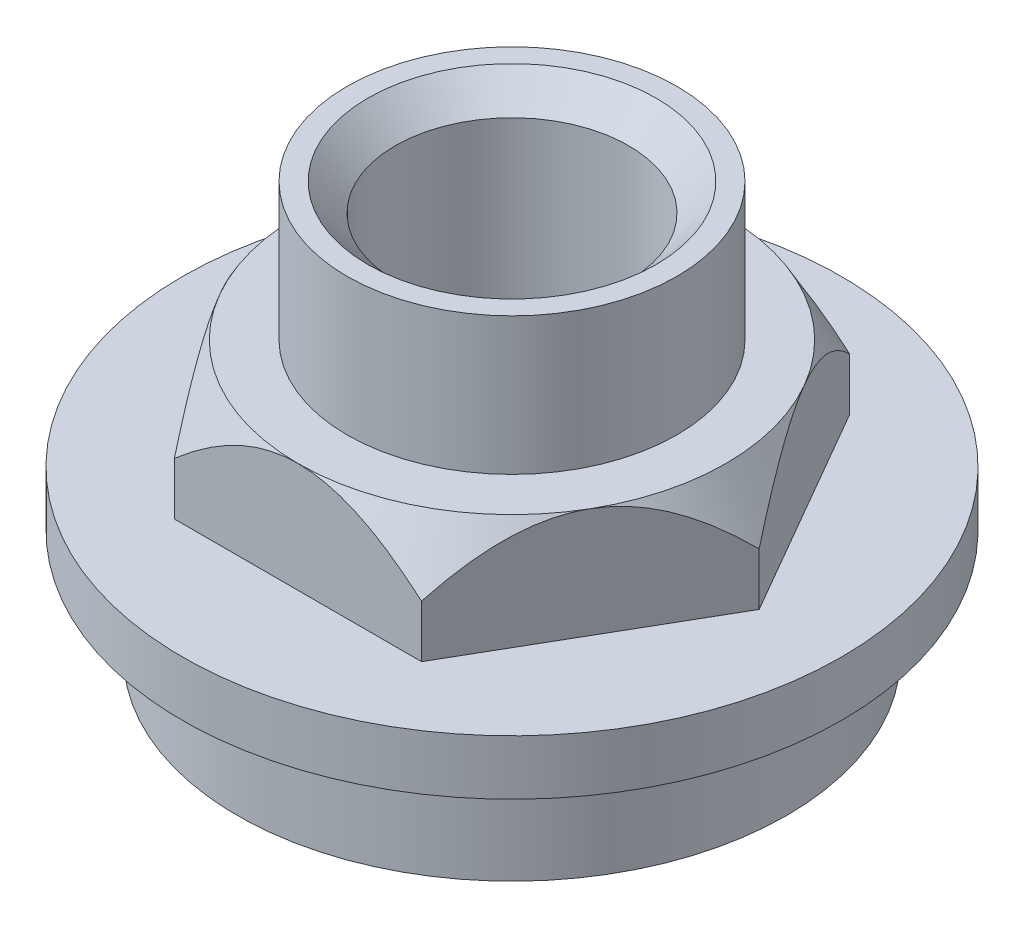
ISO-10303-21;
HEADER;
FILE_DESCRIPTION(('STEP AP214'),'2;1');
FILE_NAME('part.step','',(''),(''),'','','');
FILE_SCHEMA(('AUTOMOTIVE_DESIGN { 1 0 10303 214 1 1 1 1 }'));
ENDSEC;
DATA;
#1=APPLICATION_CONTEXT('core data for automotive mechanical design processes');
#2=APPLICATION_PROTOCOL_DEFINITION('international standard','automotive_design',2000,#1);
#3=PRODUCT_CONTEXT('',#1,'mechanical');
#4=PRODUCT('Part','Part','',(#3));
#5=PRODUCT_RELATED_PRODUCT_CATEGORY('part','',(#4));
#6=PRODUCT_DEFINITION_FORMATION('','',#4);
#7=PRODUCT_DEFINITION_CONTEXT('part definition',#1,'design');
#8=PRODUCT_DEFINITION('design','',#6,#7);
#9=PRODUCT_DEFINITION_SHAPE('','',#8);
#10=(LENGTH_UNIT() NAMED_UNIT(*) SI_UNIT(.MILLI.,.METRE.));
#11=(NAMED_UNIT(*) PLANE_ANGLE_UNIT() SI_UNIT($,.RADIAN.));
#12=(NAMED_UNIT(*) SI_UNIT($,.STERADIAN.) SOLID_ANGLE_UNIT());
#13=UNCERTAINTY_MEASURE_WITH_UNIT(LENGTH_MEASURE(1.E-05),#10,'distance_accuracy_value','');
#14=(GEOMETRIC_REPRESENTATION_CONTEXT(3) GLOBAL_UNCERTAINTY_ASSIGNED_CONTEXT((#13)) GLOBAL_UNIT_ASSIGNED_CONTEXT((#10,
#11,#12)) REPRESENTATION_CONTEXT('',''));
#15=CARTESIAN_POINT('',(0.,0.,0.));
#16=DIRECTION('',(0.,0.,1.));
#17=DIRECTION('',(1.,0.,0.));
#18=AXIS2_PLACEMENT_3D('',#15,#16,#17);
#19=CARTESIAN_POINT('',(4.5,10.,7.79422863405995));
#20=DIRECTION('',(-0.866025403784439,0.,-0.5));
#21=DIRECTION('',(-0.5,0.,0.866025403784439));
#22=AXIS2_PLACEMENT_3D('',#19,#20,#21);
#23=PLANE('',#22);
#24=CARTESIAN_POINT('',(4.49988452994616,7.91134272803115,7.79442863405995));
#25=CARTESIAN_POINT('',(4.5469510184849,7.99285906031349,7.712907084577));
#26=CARTESIAN_POINT('',(4.59448714699452,8.07328813536249,7.63057209480322));
#27=CARTESIAN_POINT('',(4.69060205581968,8.2316686769512,7.46409618935319));
#28=CARTESIAN_POINT('',(4.73918112969393,8.30961943018347,7.37995476521835));
#29=CARTESIAN_POINT('',(4.88709777078411,8.54000989560685,7.12375562756521));
#30=CARTESIAN_POINT('',(4.98813710765249,8.68815048798431,6.94875036254611));
#31=CARTESIAN_POINT('',(5.19808135019413,8.9729043963429,6.58511626770743));
#32=CARTESIAN_POINT('',(5.30712202681952,9.10912101165321,6.39625227570057));
#33=CARTESIAN_POINT('',(5.53111033178537,9.35984182078718,6.00829315119849));
#34=CARTESIAN_POINT('',(5.6460441637903,9.4743940251588,5.80922191465736));
#35=CARTESIAN_POINT('',(5.82820631895738,9.62916753436301,5.49370780669172));
#36=CARTESIAN_POINT('',(5.89330227441066,9.67947095523846,5.38095830447941));
#37=CARTESIAN_POINT('',(6.02519904670249,9.77032656179815,5.15250639351562));
#38=CARTESIAN_POINT('',(6.09199999078582,9.81087801731713,5.03680376436973));
#39=CARTESIAN_POINT('',(6.22650981257967,9.88067960177475,4.80382591890573));
#40=CARTESIAN_POINT('',(6.29420732390426,9.91001661422817,4.68657038974557));
#41=CARTESIAN_POINT('',(6.43062051230754,9.95678043096796,4.45029581660863));
#42=CARTESIAN_POINT('',(6.49933598790428,9.97420956079184,4.33127712160881));
#43=CARTESIAN_POINT('',(6.63791764656769,9.99656524465314,4.09124664780663));
#44=CARTESIAN_POINT('',(6.70778859796391,10.0013750652999,3.9702266100152));
#45=CARTESIAN_POINT('',(6.84744881862966,9.99794690494827,3.72832801202584));
#46=CARTESIAN_POINT('',(6.91723808817838,9.98970896867745,3.60744945134434));
#47=CARTESIAN_POINT('',(7.05631115031233,9.96050385692376,3.36656784176414));
#48=CARTESIAN_POINT('',(7.12559331830037,9.93950603592559,3.24656760675034));
#49=CARTESIAN_POINT('',(7.26298314963467,9.88560081510433,3.00860143843602));
#50=CARTESIAN_POINT('',(7.33109065093595,9.85269178568396,2.89063578580563));
#51=CARTESIAN_POINT('',(7.48522662157557,9.76505322936994,2.62366445338386));
#52=CARTESIAN_POINT('',(7.57074920249273,9.7067666131301,2.47553499804093));
#53=CARTESIAN_POINT('',(7.73884586442757,9.57508749850433,2.18438303898706));
#54=CARTESIAN_POINT('',(7.82141809167024,9.50168569216718,2.04136374610863));
#55=CARTESIAN_POINT('',(7.98381507448529,9.34215693481394,1.76008392087707));
#56=CARTESIAN_POINT('',(8.06362739797011,9.25597982700241,1.62184492153124));
#57=CARTESIAN_POINT('',(8.22024968961756,9.07348373491166,1.35056715479999));
#58=CARTESIAN_POINT('',(8.29706014911755,8.97716641996914,1.2175275363933));
#59=CARTESIAN_POINT('',(8.48304577260882,8.72955133612262,0.895390987029038));
#60=CARTESIAN_POINT('',(8.59064709350533,8.57352723276889,0.70902003227475));
#61=CARTESIAN_POINT('',(8.74760621190608,8.33064343239095,0.437158864493428));
#62=CARTESIAN_POINT('',(8.79890771345037,8.24869527168679,0.348302057314164));
#63=CARTESIAN_POINT('',(8.90035113450391,8.08201555452612,0.172596897955812));
#64=CARTESIAN_POINT('',(8.9504932910241,7.99728457570383,0.0857481352617818));
#65=CARTESIAN_POINT('',(9.00011547005384,7.91134272803116,-0.000200000000001088));
#66=B_SPLINE_CURVE_WITH_KNOTS('',3,(#24,#25,#26,#27,#28,#29,#30,#31,#32,#33,#34,#35,#36,#37,#38,
#39,#40,#41,#42,#43,#44,#45,#46,#47,#48,#49,#50,#51,#52,#53,#54,#55,#56,#57,#58,#59,#60,#61,#62,
#63,#64,#65),.UNSPECIFIED.,.F.,.F.,(4,2,2,2,2,2,2,2,2,2,2,2,2,2,2,2,2,2,2,2,4),(0.,
0.373551511019635,0.747209581351023,1.49833166618197,2.26885967368786,3.03765957313689,
3.45605911485134,3.87448997392117,4.28960997527388,4.70464888300762,5.12351373808427,
5.54237715730016,5.96225056204638,6.38218143227597,6.92340652775619,7.46496591231953,
8.00871075270872,8.55236621839015,9.34903128480968,9.7429348056886,10.1367570737811),.UNSPECIFIED.);
#67=CARTESIAN_POINT('',(4.5,7.9115427318801,7.79422863405995));
#68=VERTEX_POINT('',#67);
#69=CARTESIAN_POINT('',(6.75,10.,3.89711431702997));
#70=VERTEX_POINT('',#69);
#71=EDGE_CURVE('E111',#68,#70,#66,.T.);
#72=ORIENTED_EDGE('',*,*,#71,.F.);
#73=DIRECTION('',(0.,-1.,0.));
#74=VECTOR('',#73,1.);
#75=CARTESIAN_POINT('',(4.5,10.,7.79422863405995));
#76=LINE('',#75,#74);
#77=CARTESIAN_POINT('',(4.5,6.,7.79422863405995));
#78=VERTEX_POINT('',#77);
#79=EDGE_CURVE('E322',#68,#78,#76,.T.);
#80=ORIENTED_EDGE('',*,*,#79,.T.);
#81=DIRECTION('',(0.5,0.,-0.866025403784439));
#82=VECTOR('',#81,1.);
#83=CARTESIAN_POINT('',(4.5,6.,7.79422863405995));
#84=LINE('',#83,#82);
#85=CARTESIAN_POINT('',(9.,6.,0.));
#86=VERTEX_POINT('',#85);
#87=EDGE_CURVE('E307',#78,#86,#84,.T.);
#88=ORIENTED_EDGE('',*,*,#87,.T.);
#89=DIRECTION('',(0.,-1.,0.));
#90=VECTOR('',#89,1.);
#91=CARTESIAN_POINT('',(9.,10.,0.));
#92=LINE('',#91,#90);
#93=CARTESIAN_POINT('',(9.,7.91154273188011,0.));
#94=VERTEX_POINT('',#93);
#95=EDGE_CURVE('E59',#94,#86,#92,.T.);
#96=ORIENTED_EDGE('',*,*,#95,.F.);
#97=EDGE_CURVE('E121',#70,#94,#66,.T.);
#98=ORIENTED_EDGE('',*,*,#97,.F.);
#99=EDGE_LOOP('',(#72,#80,#88,#96,#98));
#100=FACE_BOUND('',#99,.T.);
#101=ADVANCED_FACE('F36',(#100),#23,.F.);
#102=CARTESIAN_POINT('',(9.,10.,0.));
#103=DIRECTION('',(-0.866025403784438,0.,0.5));
#104=DIRECTION('',(0.5,0.,0.866025403784439));
#105=AXIS2_PLACEMENT_3D('',#102,#103,#104);
#106=PLANE('',#105);
#107=CARTESIAN_POINT('',(9.00011547005384,7.91134272803116,0.00019999999999863));
#108=CARTESIAN_POINT('',(8.9530489815151,7.9928590603135,-0.0813215494829471));
#109=CARTESIAN_POINT('',(8.90551285300548,8.0732881353625,-0.163656539256728));
#110=CARTESIAN_POINT('',(8.80939794418032,8.23166867695121,-0.33013244470676));
#111=CARTESIAN_POINT('',(8.76081887030607,8.30961943018348,-0.414273868841603));
#112=CARTESIAN_POINT('',(8.61290222921588,8.54000989560686,-0.670473006494739));
#113=CARTESIAN_POINT('',(8.5118628923475,8.68815048798432,-0.84547827151384));
#114=CARTESIAN_POINT('',(8.30191864980587,8.97290439634291,-1.20911236635251));
#115=CARTESIAN_POINT('',(8.19287797318048,9.10912101165322,-1.39797635835938));
#116=CARTESIAN_POINT('',(7.96888966821463,9.35984182078719,-1.78593548286146));
#117=CARTESIAN_POINT('',(7.8539558362097,9.47439402515881,-1.98500671940258));
#118=CARTESIAN_POINT('',(7.67179368104261,9.62916753436302,-2.30052082736823));
#119=CARTESIAN_POINT('',(7.60669772558933,9.67947095523846,-2.41327032958054));
#120=CARTESIAN_POINT('',(7.47480095329751,9.77032656179815,-2.64172224054433));
#121=CARTESIAN_POINT('',(7.40800000921418,9.81087801731714,-2.75742486969022));
#122=CARTESIAN_POINT('',(7.27349018742032,9.88067960177475,-2.99040271515422));
#123=CARTESIAN_POINT('',(7.20579267609573,9.91001661422818,-3.10765824431437));
#124=CARTESIAN_POINT('',(7.06937948769246,9.95678043096796,-3.34393281745131));
#125=CARTESIAN_POINT('',(7.00066401209571,9.97420956079185,-3.46295151245113));
#126=CARTESIAN_POINT('',(6.86208235343231,9.99656524465314,-3.70298198625332));
#127=CARTESIAN_POINT('',(6.79221140203609,10.0013750652999,-3.82400202404475));
#128=CARTESIAN_POINT('',(6.65255118137034,9.99794690494827,-4.06590062203411));
#129=CARTESIAN_POINT('',(6.58276191182162,9.98970896867745,-4.18677918271561));
#130=CARTESIAN_POINT('',(6.44368884968766,9.96050385692376,-4.4276607922958));
#131=CARTESIAN_POINT('',(6.37440668169963,9.93950603592559,-4.5476610273096));
#132=CARTESIAN_POINT('',(6.23701685036533,9.88560081510433,-4.78562719562393));
#133=CARTESIAN_POINT('',(6.16890934906405,9.85269178568397,-4.90359284825431));
#134=CARTESIAN_POINT('',(6.01477337842442,9.76505322936995,-5.17056418067609));
#135=CARTESIAN_POINT('',(5.92925079750727,9.7067666131301,-5.31869363601901));
#136=CARTESIAN_POINT('',(5.76115413557243,9.57508749850433,-5.60984559507289));
#137=CARTESIAN_POINT('',(5.67858190832976,9.50168569216718,-5.75286488795132));
#138=CARTESIAN_POINT('',(5.5161849255147,9.34215693481394,-6.03414471318288));
#139=CARTESIAN_POINT('',(5.43637260202989,9.25597982700242,-6.17238371252871));
#140=CARTESIAN_POINT('',(5.27975031038244,9.07348373491167,-6.44366147925996));
#141=CARTESIAN_POINT('',(5.20293985088245,8.97716641996914,-6.57670109766664));
#142=CARTESIAN_POINT('',(5.01695422739118,8.72955133612262,-6.8988376470309));
#143=CARTESIAN_POINT('',(4.90935290649466,8.57352723276889,-7.0852086017852));
#144=CARTESIAN_POINT('',(4.75239378809391,8.33064343239095,-7.35706976956652));
#145=CARTESIAN_POINT('',(4.70109228654963,8.24869527168678,-7.44592657674578));
#146=CARTESIAN_POINT('',(4.59964886549608,8.08201555452612,-7.62163173610413));
#147=CARTESIAN_POINT('',(4.5495067089759,7.99728457570383,-7.70848049879816));
#148=CARTESIAN_POINT('',(4.49988452994616,7.91134272803115,-7.79442863405995));
#149=B_SPLINE_CURVE_WITH_KNOTS('',3,(#107,#108,#109,#110,#111,#112,#113,#114,#115,#116,#117,
#118,#119,#120,#121,#122,#123,#124,#125,#126,#127,#128,#129,#130,#131,#132,#133,#134,#135,#136,
#137,#138,#139,#140,#141,#142,#143,#144,#145,#146,#147,#148),.UNSPECIFIED.,.F.,.F.,(4,2,2,2,2,2,
2,2,2,2,2,2,2,2,2,2,2,2,2,2,4),(0.,0.373551511019635,0.747209581351022,1.49833166618197,
2.26885967368786,3.03765957313689,3.45605911485133,3.87448997392117,4.28960997527388,
4.70464888300762,5.12351373808427,5.54237715730016,5.96225056204637,6.38218143227597,
6.92340652775618,7.46496591231953,8.00871075270872,8.55236621839015,9.34903128480968,
9.74293480568861,10.1367570737811),.UNSPECIFIED.);
#150=CARTESIAN_POINT('',(6.75,10.,-3.89711431702997));
#151=VERTEX_POINT('',#150);
#152=EDGE_CURVE('E127',#94,#151,#149,.T.);
#153=ORIENTED_EDGE('',*,*,#152,.F.);
#154=ORIENTED_EDGE('',*,*,#95,.T.);
#155=DIRECTION('',(-0.5,0.,-0.866025403784438));
#156=VECTOR('',#155,1.);
#157=CARTESIAN_POINT('',(9.,6.,0.));
#158=LINE('',#157,#156);
#159=CARTESIAN_POINT('',(4.5,6.,-7.79422863405995));
#160=VERTEX_POINT('',#159);
#161=EDGE_CURVE('E309',#86,#160,#158,.T.);
#162=ORIENTED_EDGE('',*,*,#161,.T.);
#163=DIRECTION('',(0.,-1.,0.));
#164=VECTOR('',#163,1.);
#165=CARTESIAN_POINT('',(4.5,10.,-7.79422863405995));
#166=LINE('',#165,#164);
#167=CARTESIAN_POINT('',(4.49999999999999,7.91154273188011,-7.79422863405995));
#168=VERTEX_POINT('',#167);
#169=EDGE_CURVE('E207',#168,#160,#166,.T.);
#170=ORIENTED_EDGE('',*,*,#169,.F.);
#171=EDGE_CURVE('E136',#151,#168,#149,.T.);
#172=ORIENTED_EDGE('',*,*,#171,.F.);
#173=EDGE_LOOP('',(#153,#154,#162,#170,#172));
#174=FACE_BOUND('',#173,.T.);
#175=ADVANCED_FACE('F198',(#174),#106,.F.);
#176=CARTESIAN_POINT('',(4.5,10.,-7.79422863405995));
#177=DIRECTION('',(0.,0.,1.));
#178=DIRECTION('',(1.,0.,0.));
#179=AXIS2_PLACEMENT_3D('',#176,#177,#178);
#180=PLANE('',#179);
#181=CARTESIAN_POINT('',(-10.3189194004154,1.10155601884791,-7.79422863405995));
#182=CARTESIAN_POINT('',(-10.1026892607673,1.40034541665737,-7.79422863405995));
#183=CARTESIAN_POINT('',(-9.88488755277598,1.69801229142663,-7.79422863405995));
#184=CARTESIAN_POINT('',(-9.44541693321907,2.29057045380564,-7.79422863405995));
#185=CARTESIAN_POINT('',(-9.22374723153252,2.5854611549258,-7.79422863405995));
#186=CARTESIAN_POINT('',(-8.77392653751467,3.17440328969509,-7.79422863405995));
#187=CARTESIAN_POINT('',(-8.54573557999823,3.46842427613291,-7.79422863405995));
#188=CARTESIAN_POINT('',(-8.08385965209259,4.05208341853964,-7.79422863405995));
#189=CARTESIAN_POINT('',(-7.85017521926269,4.34172199882378,-7.79422863405995));
#190=CARTESIAN_POINT('',(-7.35043659841696,4.9465455921992,-7.79422863405995));
#191=CARTESIAN_POINT('',(-7.08361737316929,5.26110065806897,-7.79422863405995));
#192=CARTESIAN_POINT('',(-6.53950552419685,5.88128603376838,-7.79422863405995));
#193=CARTESIAN_POINT('',(-6.26220951122522,6.18691339779437,-7.79422863405995));
#194=CARTESIAN_POINT('',(-5.83681843706123,6.635308278016,-7.79422863405995));
#195=CARTESIAN_POINT('',(-5.69372867534287,6.78282710372589,-7.79422863405995));
#196=CARTESIAN_POINT('',(-5.4037712211181,7.07409651729314,-7.79422863405995));
#197=CARTESIAN_POINT('',(-5.25690379899336,7.21784737335983,-7.79422863405995));
#198=CARTESIAN_POINT('',(-4.95894101024782,7.50072676793045,-7.79422863405995));
#199=CARTESIAN_POINT('',(-4.8078482618162,7.63985805690835,-7.79422863405995));
#200=CARTESIAN_POINT('',(-4.50074931290881,7.9125670536672,-7.79422863405995));
#201=CARTESIAN_POINT('',(-4.34474396486314,8.04614571570409,-7.79422863405995));
#202=CARTESIAN_POINT('',(-4.08866742494503,8.2559974433133,-7.79422863405995));
#203=CARTESIAN_POINT('',(-3.99035321674057,8.33441428098617,-7.79422863405995));
#204=CARTESIAN_POINT('',(-3.79144177238735,8.48829293533106,-7.79422863405995));
#205=CARTESIAN_POINT('',(-3.6908445126818,8.56375472149062,-7.79422863405995));
#206=CARTESIAN_POINT('',(-3.38522670149573,8.7851669939984,-7.79422863405995));
#207=CARTESIAN_POINT('',(-3.17647314313998,8.92606708067272,-7.79422863405995));
#208=CARTESIAN_POINT('',(-2.75103533104867,9.18784556255837,-7.79422863405995));
#209=CARTESIAN_POINT('',(-2.53452023074788,9.30899614864572,-7.79422863405995));
#210=CARTESIAN_POINT('',(-2.08999866291142,9.52793364114923,-7.79422863405995));
#211=CARTESIAN_POINT('',(-1.86200724776275,9.62575023295267,-7.79422863405995));
#212=CARTESIAN_POINT('',(-1.50061495492531,9.75378794641114,-7.79422863405995));
#213=CARTESIAN_POINT('',(-1.37093816981285,9.79459663586465,-7.79422863405995));
#214=CARTESIAN_POINT('',(-1.10876958694867,9.86592912524405,-7.79422863405995));
#215=CARTESIAN_POINT('',(-0.976278224988463,9.89645450521162,-7.79422863405995));
#216=CARTESIAN_POINT('',(-0.709274672158217,9.94616591482603,-7.79422863405995));
#217=CARTESIAN_POINT('',(-0.574764147986172,9.96536082048052,-7.79422863405995));
#218=CARTESIAN_POINT('',(-0.304555515636597,9.99171756938012,-7.79422863405995));
#219=CARTESIAN_POINT('',(-0.16885740404954,9.99887937806717,-7.79422863405995));
#220=CARTESIAN_POINT('',(0.102978110753352,10.0008795138909,-7.79422863405995));
#221=CARTESIAN_POINT('',(0.239115749705859,9.99568626831545,-7.79422863405995));
#222=CARTESIAN_POINT('',(0.510366402233498,9.97312488457935,-7.79422863405995));
#223=CARTESIAN_POINT('',(0.645479417470799,9.95575676617332,-7.79422863405995));
#224=CARTESIAN_POINT('',(0.913835484487121,9.90949818610705,-7.79422863405995));
#225=CARTESIAN_POINT('',(1.04707658770439,9.88059652333766,-7.79422863405995));
#226=CARTESIAN_POINT('',(1.31082259932374,9.81227866070904,-7.79422863405995));
#227=CARTESIAN_POINT('',(1.44132709372183,9.77286088213662,-7.79422863405995));
#228=CARTESIAN_POINT('',(1.75628736858611,9.66512151535156,-7.79422863405995));
#229=CARTESIAN_POINT('',(1.93901294882939,9.59173312009571,-7.79422863405995));
#230=CARTESIAN_POINT('',(2.29722481819613,9.42904010292295,-7.79422863405995));
#231=CARTESIAN_POINT('',(2.47270687033781,9.33972632373957,-7.79422863405995));
#232=CARTESIAN_POINT('',(2.81822438864309,9.14743704712432,-7.79422863405995));
#233=CARTESIAN_POINT('',(2.98818906710186,9.04433549604081,-7.79422863405995));
#234=CARTESIAN_POINT('',(3.32129235175154,8.8278656294455,-7.79422863405995));
#235=CARTESIAN_POINT('',(3.48443343805567,8.71450109238476,-7.79422863405995));
#236=CARTESIAN_POINT('',(3.90042461276207,8.40932953814065,-7.79422863405995));
#237=CARTESIAN_POINT('',(4.14858813196132,8.21114954405065,-7.79422863405995));
#238=CARTESIAN_POINT('',(4.63235139279009,7.79990569963162,-7.79422863405995));
#239=CARTESIAN_POINT('',(4.86794208081603,7.58683137237168,-7.79422863405995));
#240=CARTESIAN_POINT('',(5.32968329690669,7.14902926121048,-7.79422863405995));
#241=CARTESIAN_POINT('',(5.55579428682315,6.92426003567569,-7.79422863405995));
#242=CARTESIAN_POINT('',(5.99947978246801,6.46661804206938,-7.79422863405995));
#243=CARTESIAN_POINT('',(6.21705659107266,6.23374749252367,-7.79422863405995));
#244=CARTESIAN_POINT('',(6.63086567426931,5.77758379751534,-7.79422863405995));
#245=CARTESIAN_POINT('',(6.82754974773812,5.55469868896423,-7.79422863405995));
#246=CARTESIAN_POINT('',(7.21585221929807,5.1045333447795,-7.79422863405995));
#247=CARTESIAN_POINT('',(7.40747014282666,4.87725270083052,-7.79422863405995));
#248=CARTESIAN_POINT('',(7.78471383254186,4.42119084224828,-7.79422863405995));
#249=CARTESIAN_POINT('',(7.97037783252336,4.19244116166559,-7.79422863405995));
#250=CARTESIAN_POINT('',(8.33802656288638,3.73209132728566,-7.79422863405995));
#251=CARTESIAN_POINT('',(8.52001216723017,3.50049187212358,-7.79422863405995));
#252=CARTESIAN_POINT('',(8.70047507928161,3.26772875291554,-7.79422863405995));
#253=B_SPLINE_CURVE_WITH_KNOTS('',3,(#181,#182,#183,#184,#185,#186,#187,#188,#189,#190,#191,
#192,#193,#194,#195,#196,#197,#198,#199,#200,#201,#202,#203,#204,#205,#206,#207,#208,#209,#210,
#211,#212,#213,#214,#215,#216,#217,#218,#219,#220,#221,#222,#223,#224,#225,#226,#227,#228,#229,
#230,#231,#232,#233,#234,#235,#236,#237,#238,#239,#240,#241,#242,#243,#244,#245,#246,#247,#248,
#249,#250,#251,#252),.UNSPECIFIED.,.F.,.F.,(4,2,2,2,2,2,2,2,2,2,2,2,2,2,2,2,2,2,2,2,2,2,2,2,2,2,
2,2,2,2,2,2,2,2,2,4),(0.,1.1064825097829,2.21319375162325,3.32968533580857,4.44606811774192,
5.68333974898371,6.92101512425871,7.53750628679426,8.15395344680041,8.77002674324424,
9.38599372192553,9.76321386521185,10.1404379024708,10.8952482369644,11.6385655596191,
12.3809321335025,12.7884195841924,13.1958443954056,13.6029496152714,14.0100560043075,
14.4182038500076,14.8263510334592,15.2348955683653,15.6435014698392,16.233247190709,
16.8233331217286,17.4192388946999,18.014926162588,18.9667928608557,19.9193359904176,
20.8755211313956,21.8314464535492,22.7231321715073,23.6149011226994,24.4987050563704,
25.3822964753754),.UNSPECIFIED.);
#254=CARTESIAN_POINT('',(0.,10.,-7.79422863405994));
#255=VERTEX_POINT('',#254);
#256=EDGE_CURVE('E192',#168,#255,#253,.F.);
#257=ORIENTED_EDGE('',*,*,#256,.F.);
#258=ORIENTED_EDGE('',*,*,#169,.T.);
#259=DIRECTION('',(-1.,0.,0.));
#260=VECTOR('',#259,1.);
#261=CARTESIAN_POINT('',(4.5,6.,-7.79422863405995));
#262=LINE('',#261,#260);
#263=CARTESIAN_POINT('',(-4.50000000000001,6.,-7.79422863405995));
#264=VERTEX_POINT('',#263);
#265=EDGE_CURVE('E225',#160,#264,#262,.T.);
#266=ORIENTED_EDGE('',*,*,#265,.T.);
#267=DIRECTION('',(0.,-1.,0.));
#268=VECTOR('',#267,1.);
#269=CARTESIAN_POINT('',(-4.5,10.,-7.79422863405995));
#270=LINE('',#269,#268);
#271=CARTESIAN_POINT('',(-4.5,7.9115427318801,-7.79422863405995));
#272=VERTEX_POINT('',#271);
#273=EDGE_CURVE('E223',#272,#264,#270,.T.);
#274=ORIENTED_EDGE('',*,*,#273,.F.);
#275=EDGE_CURVE('E186',#255,#272,#253,.F.);
#276=ORIENTED_EDGE('',*,*,#275,.F.);
#277=EDGE_LOOP('',(#257,#258,#266,#274,#276));
#278=FACE_BOUND('',#277,.T.);
#279=ADVANCED_FACE('F194',(#278),#180,.F.);
#280=CARTESIAN_POINT('',(-4.5,10.,-7.79422863405995));
#281=DIRECTION('',(0.866025403784439,0.,0.5));
#282=DIRECTION('',(0.5,0.,-0.866025403784439));
#283=AXIS2_PLACEMENT_3D('',#280,#281,#282);
#284=PLANE('',#283);
#285=CARTESIAN_POINT('',(-4.49988452994616,7.91134272803115,-7.79442863405995));
#286=CARTESIAN_POINT('',(-4.5469510184849,7.99285906031349,-7.712907084577));
#287=CARTESIAN_POINT('',(-4.59448714699452,8.07328813536249,-7.63057209480322));
#288=CARTESIAN_POINT('',(-4.69060205581968,8.2316686769512,-7.46409618935319));
#289=CARTESIAN_POINT('',(-4.73918112969393,8.30961943018347,-7.37995476521835));
#290=CARTESIAN_POINT('',(-4.88709777078412,8.54000989560685,-7.12375562756521));
#291=CARTESIAN_POINT('',(-4.9881371076525,8.68815048798431,-6.94875036254611));
#292=CARTESIAN_POINT('',(-5.19808135019413,8.9729043963429,-6.58511626770743));
#293=CARTESIAN_POINT('',(-5.30712202681952,9.10912101165321,-6.39625227570057));
#294=CARTESIAN_POINT('',(-5.53111033178537,9.35984182078718,-6.00829315119849));
#295=CARTESIAN_POINT('',(-5.6460441637903,9.4743940251588,-5.80922191465736));
#296=CARTESIAN_POINT('',(-5.82820631895739,9.62916753436301,-5.49370780669172));
#297=CARTESIAN_POINT('',(-5.89330227441067,9.67947095523846,-5.38095830447941));
#298=CARTESIAN_POINT('',(-6.02519904670249,9.77032656179815,-5.15250639351562));
#299=CARTESIAN_POINT('',(-6.09199999078582,9.81087801731713,-5.03680376436973));
#300=CARTESIAN_POINT('',(-6.22650981257968,9.88067960177474,-4.80382591890573));
#301=CARTESIAN_POINT('',(-6.29420732390427,9.91001661422817,-4.68657038974557));
#302=CARTESIAN_POINT('',(-6.43062051230754,9.95678043096796,-4.45029581660863));
#303=CARTESIAN_POINT('',(-6.49933598790428,9.97420956079184,-4.33127712160881));
#304=CARTESIAN_POINT('',(-6.63791764656769,9.99656524465313,-4.09124664780663));
#305=CARTESIAN_POINT('',(-6.70778859796391,10.0013750652999,-3.9702266100152));
#306=CARTESIAN_POINT('',(-6.84744881862966,9.99794690494826,-3.72832801202583));
#307=CARTESIAN_POINT('',(-6.91723808817838,9.98970896867745,-3.60744945134434));
#308=CARTESIAN_POINT('',(-7.05631115031234,9.96050385692375,-3.36656784176414));
#309=CARTESIAN_POINT('',(-7.12559331830037,9.93950603592558,-3.24656760675034));
#310=CARTESIAN_POINT('',(-7.26298314963467,9.88560081510432,-3.00860143843602));
#311=CARTESIAN_POINT('',(-7.33109065093595,9.85269178568396,-2.89063578580564));
#312=CARTESIAN_POINT('',(-7.48522662157557,9.76505322936994,-2.62366445338386));
#313=CARTESIAN_POINT('',(-7.57074920249273,9.70676661313009,-2.47553499804093));
#314=CARTESIAN_POINT('',(-7.73884586442757,9.57508749850432,-2.18438303898706));
#315=CARTESIAN_POINT('',(-7.82141809167024,9.50168569216718,-2.04136374610863));
#316=CARTESIAN_POINT('',(-7.98381507448529,9.34215693481393,-1.76008392087707));
#317=CARTESIAN_POINT('',(-8.06362739797011,9.25597982700241,-1.62184492153124));
#318=CARTESIAN_POINT('',(-8.22024968961756,9.07348373491166,-1.35056715479999));
#319=CARTESIAN_POINT('',(-8.29706014911755,8.97716641996914,-1.2175275363933));
#320=CARTESIAN_POINT('',(-8.48304577260882,8.72955133612261,-0.895390987029039));
#321=CARTESIAN_POINT('',(-8.59064709350534,8.57352723276889,-0.709020032274749));
#322=CARTESIAN_POINT('',(-8.74760621190609,8.33064343239094,-0.437158864493427));
#323=CARTESIAN_POINT('',(-8.79890771345037,8.24869527168678,-0.348302057314162));
#324=CARTESIAN_POINT('',(-8.90035113450392,8.08201555452611,-0.172596897955811));
#325=CARTESIAN_POINT('',(-8.9504932910241,7.99728457570382,-0.0857481352617808));
#326=CARTESIAN_POINT('',(-9.00011547005384,7.91134272803115,0.000200000000002332));
#327=B_SPLINE_CURVE_WITH_KNOTS('',3,(#285,#286,#287,#288,#289,#290,#291,#292,#293,#294,#295,
#296,#297,#298,#299,#300,#301,#302,#303,#304,#305,#306,#307,#308,#309,#310,#311,#312,#313,#314,
#315,#316,#317,#318,#319,#320,#321,#322,#323,#324,#325,#326),.UNSPECIFIED.,.F.,.F.,(4,2,2,2,2,2,
2,2,2,2,2,2,2,2,2,2,2,2,2,2,4),(0.,0.373551511019636,0.747209581351023,1.49833166618197,
2.26885967368786,3.03765957313689,3.45605911485134,3.87448997392117,4.28960997527388,
4.70464888300762,5.12351373808427,5.54237715730016,5.96225056204638,6.38218143227597,
6.92340652775618,7.46496591231953,8.00871075270872,8.55236621839015,9.34903128480969,
9.74293480568861,10.1367570737811),.UNSPECIFIED.);
#328=CARTESIAN_POINT('',(-6.75,10.,-3.89711431702997));
#329=VERTEX_POINT('',#328);
#330=EDGE_CURVE('E193',#272,#329,#327,.T.);
#331=ORIENTED_EDGE('',*,*,#330,.F.);
#332=ORIENTED_EDGE('',*,*,#273,.T.);
#333=DIRECTION('',(-0.5,0.,0.866025403784439));
#334=VECTOR('',#333,1.);
#335=CARTESIAN_POINT('',(-4.5,6.,-7.79422863405995));
#336=LINE('',#335,#334);
#337=CARTESIAN_POINT('',(-9.,6.,0.));
#338=VERTEX_POINT('',#337);
#339=EDGE_CURVE('E314',#264,#338,#336,.T.);
#340=ORIENTED_EDGE('',*,*,#339,.T.);
#341=DIRECTION('',(0.,-1.,0.));
#342=VECTOR('',#341,1.);
#343=CARTESIAN_POINT('',(-9.,10.,0.));
#344=LINE('',#343,#342);
#345=CARTESIAN_POINT('',(-9.,7.9115427318801,0.));
#346=VERTEX_POINT('',#345);
#347=EDGE_CURVE('E229',#346,#338,#344,.T.);
#348=ORIENTED_EDGE('',*,*,#347,.F.);
#349=EDGE_CURVE('E180',#329,#346,#327,.T.);
#350=ORIENTED_EDGE('',*,*,#349,.F.);
#351=EDGE_LOOP('',(#331,#332,#340,#348,#350));
#352=FACE_BOUND('',#351,.T.);
#353=ADVANCED_FACE('F197',(#352),#284,.F.);
#354=CARTESIAN_POINT('',(-9.,10.,0.));
#355=DIRECTION('',(0.866025403784438,0.,-0.5));
#356=DIRECTION('',(-0.5,0.,-0.866025403784438));
#357=AXIS2_PLACEMENT_3D('',#354,#355,#356);
#358=PLANE('',#357);
#359=CARTESIAN_POINT('',(-9.00011547005384,7.91134272803115,-0.000199999999998941));
#360=CARTESIAN_POINT('',(-8.9530489815151,7.99285906031349,0.0813215494829467));
#361=CARTESIAN_POINT('',(-8.90551285300549,8.07328813536249,0.163656539256727));
#362=CARTESIAN_POINT('',(-8.80939794418032,8.2316686769512,0.330132444706759));
#363=CARTESIAN_POINT('',(-8.76081887030607,8.30961943018347,0.414273868841602));
#364=CARTESIAN_POINT('',(-8.61290222921589,8.54000989560685,0.670473006494739));
#365=CARTESIAN_POINT('',(-8.51186289234751,8.68815048798431,0.84547827151384));
#366=CARTESIAN_POINT('',(-8.30191864980587,8.9729043963429,1.20911236635251));
#367=CARTESIAN_POINT('',(-8.19287797318048,9.10912101165321,1.39797635835938));
#368=CARTESIAN_POINT('',(-7.96888966821463,9.35984182078718,1.78593548286146));
#369=CARTESIAN_POINT('',(-7.8539558362097,9.47439402515881,1.98500671940258));
#370=CARTESIAN_POINT('',(-7.67179368104262,9.62916753436302,2.30052082736823));
#371=CARTESIAN_POINT('',(-7.60669772558934,9.67947095523846,2.41327032958054));
#372=CARTESIAN_POINT('',(-7.47480095329751,9.77032656179815,2.64172224054433));
#373=CARTESIAN_POINT('',(-7.40800000921418,9.81087801731713,2.75742486969022));
#374=CARTESIAN_POINT('',(-7.27349018742033,9.88067960177475,2.99040271515422));
#375=CARTESIAN_POINT('',(-7.20579267609574,9.91001661422817,3.10765824431437));
#376=CARTESIAN_POINT('',(-7.06937948769246,9.95678043096796,3.34393281745131));
#377=CARTESIAN_POINT('',(-7.00066401209572,9.97420956079184,3.46295151245113));
#378=CARTESIAN_POINT('',(-6.86208235343231,9.99656524465314,3.70298198625332));
#379=CARTESIAN_POINT('',(-6.79221140203609,10.0013750652999,3.82400202404475));
#380=CARTESIAN_POINT('',(-6.65255118137034,9.99794690494826,4.06590062203411));
#381=CARTESIAN_POINT('',(-6.58276191182162,9.98970896867745,4.18677918271561));
#382=CARTESIAN_POINT('',(-6.44368884968766,9.96050385692376,4.42766079229581));
#383=CARTESIAN_POINT('',(-6.37440668169963,9.93950603592559,4.5476610273096));
#384=CARTESIAN_POINT('',(-6.23701685036533,9.88560081510433,4.78562719562393));
#385=CARTESIAN_POINT('',(-6.16890934906405,9.85269178568396,4.90359284825431));
#386=CARTESIAN_POINT('',(-6.01477337842443,9.76505322936994,5.17056418067609));
#387=CARTESIAN_POINT('',(-5.92925079750727,9.70676661313009,5.31869363601901));
#388=CARTESIAN_POINT('',(-5.76115413557243,9.57508749850432,5.60984559507289));
#389=CARTESIAN_POINT('',(-5.67858190832976,9.50168569216718,5.75286488795132));
#390=CARTESIAN_POINT('',(-5.51618492551471,9.34215693481394,6.03414471318288));
#391=CARTESIAN_POINT('',(-5.43637260202989,9.25597982700241,6.17238371252871));
#392=CARTESIAN_POINT('',(-5.27975031038244,9.07348373491166,6.44366147925996));
#393=CARTESIAN_POINT('',(-5.20293985088245,8.97716641996914,6.57670109766665));
#394=CARTESIAN_POINT('',(-5.01695422739118,8.72955133612262,6.89883764703091));
#395=CARTESIAN_POINT('',(-4.90935290649466,8.57352723276889,7.0852086017852));
#396=CARTESIAN_POINT('',(-4.75239378809391,8.33064343239095,7.35706976956652));
#397=CARTESIAN_POINT('',(-4.70109228654963,8.24869527168678,7.44592657674578));
#398=CARTESIAN_POINT('',(-4.59964886549608,8.08201555452611,7.62163173610414));
#399=CARTESIAN_POINT('',(-4.5495067089759,7.99728457570383,7.70848049879817));
#400=CARTESIAN_POINT('',(-4.49988452994616,7.91134272803115,7.79442863405995));
#401=B_SPLINE_CURVE_WITH_KNOTS('',3,(#359,#360,#361,#362,#363,#364,#365,#366,#367,#368,#369,
#370,#371,#372,#373,#374,#375,#376,#377,#378,#379,#380,#381,#382,#383,#384,#385,#386,#387,#388,
#389,#390,#391,#392,#393,#394,#395,#396,#397,#398,#399,#400),.UNSPECIFIED.,.F.,.F.,(4,2,2,2,2,2,
2,2,2,2,2,2,2,2,2,2,2,2,2,2,4),(0.,0.373551511019634,0.747209581351022,1.49833166618197,
2.26885967368786,3.03765957313689,3.45605911485133,3.87448997392117,4.28960997527388,
4.70464888300762,5.12351373808427,5.54237715730016,5.96225056204638,6.38218143227597,
6.92340652775618,7.46496591231953,8.00871075270872,8.55236621839014,9.34903128480968,
9.74293480568861,10.1367570737811),.UNSPECIFIED.);
#402=CARTESIAN_POINT('',(-6.75,10.,3.89711431702997));
#403=VERTEX_POINT('',#402);
#404=EDGE_CURVE('E337',#346,#403,#401,.T.);
#405=ORIENTED_EDGE('',*,*,#404,.F.);
#406=ORIENTED_EDGE('',*,*,#347,.T.);
#407=DIRECTION('',(0.5,0.,0.866025403784438));
#408=VECTOR('',#407,1.);
#409=CARTESIAN_POINT('',(-9.,6.,0.));
#410=LINE('',#409,#408);
#411=CARTESIAN_POINT('',(-4.5,6.,7.79422863405995));
#412=VERTEX_POINT('',#411);
#413=EDGE_CURVE('E316',#338,#412,#410,.T.);
#414=ORIENTED_EDGE('',*,*,#413,.T.);
#415=DIRECTION('',(0.,-1.,0.));
#416=VECTOR('',#415,1.);
#417=CARTESIAN_POINT('',(-4.5,10.,7.79422863405995));
#418=LINE('',#417,#416);
#419=CARTESIAN_POINT('',(-4.50000000000014,7.91154273188003,7.79422863405995));
#420=VERTEX_POINT('',#419);
#421=EDGE_CURVE('E232',#420,#412,#418,.T.);
#422=ORIENTED_EDGE('',*,*,#421,.F.);
#423=EDGE_CURVE('E172',#403,#420,#401,.T.);
#424=ORIENTED_EDGE('',*,*,#423,.F.);
#425=EDGE_LOOP('',(#405,#406,#414,#422,#424));
#426=FACE_BOUND('',#425,.T.);
#427=ADVANCED_FACE('F335',(#426),#358,.F.);
#428=CARTESIAN_POINT('',(-4.5,10.,7.79422863405995));
#429=DIRECTION('',(0.,0.,-1.));
#430=DIRECTION('',(-1.,0.,0.));
#431=AXIS2_PLACEMENT_3D('',#428,#429,#430);
#432=PLANE('',#431);
#433=CARTESIAN_POINT('',(-10.3189194004154,1.10155601884792,7.79422863405995));
#434=CARTESIAN_POINT('',(-10.1026892607673,1.40034541665737,7.79422863405995));
#435=CARTESIAN_POINT('',(-9.88488755277598,1.69801229142663,7.79422863405995));
#436=CARTESIAN_POINT('',(-9.44541693321907,2.29057045380565,7.79422863405995));
#437=CARTESIAN_POINT('',(-9.22374723153252,2.5854611549258,7.79422863405995));
#438=CARTESIAN_POINT('',(-8.77392653751466,3.1744032896951,7.79422863405995));
#439=CARTESIAN_POINT('',(-8.54573557999822,3.46842427613292,7.79422863405995));
#440=CARTESIAN_POINT('',(-8.08385965209258,4.05208341853965,7.79422863405995));
#441=CARTESIAN_POINT('',(-7.85017521926269,4.34172199882379,7.79422863405995));
#442=CARTESIAN_POINT('',(-7.35043659841696,4.94654559219921,7.79422863405995));
#443=CARTESIAN_POINT('',(-7.08361737316929,5.26110065806897,7.79422863405995));
#444=CARTESIAN_POINT('',(-6.53950552419684,5.88128603376838,7.79422863405995));
#445=CARTESIAN_POINT('',(-6.26220951122521,6.18691339779437,7.79422863405995));
#446=CARTESIAN_POINT('',(-5.83681843706122,6.63530827801601,7.79422863405995));
#447=CARTESIAN_POINT('',(-5.69372867534287,6.7828271037259,7.79422863405995));
#448=CARTESIAN_POINT('',(-5.4037712211181,7.07409651729315,7.79422863405995));
#449=CARTESIAN_POINT('',(-5.25690379899336,7.21784737335984,7.79422863405995));
#450=CARTESIAN_POINT('',(-4.95894101024781,7.50072676793045,7.79422863405995));
#451=CARTESIAN_POINT('',(-4.80784826181619,7.63985805690835,7.79422863405995));
#452=CARTESIAN_POINT('',(-4.5007493129088,7.9125670536672,7.79422863405995));
#453=CARTESIAN_POINT('',(-4.34474396486313,8.0461457157041,7.79422863405995));
#454=CARTESIAN_POINT('',(-4.08866742494502,8.2559974433133,7.79422863405995));
#455=CARTESIAN_POINT('',(-3.99035321674057,8.33441428098617,7.79422863405995));
#456=CARTESIAN_POINT('',(-3.79144177238735,8.48829293533107,7.79422863405995));
#457=CARTESIAN_POINT('',(-3.6908445126818,8.56375472149062,7.79422863405995));
#458=CARTESIAN_POINT('',(-3.38522670149573,8.7851669939984,7.79422863405995));
#459=CARTESIAN_POINT('',(-3.17647314313998,8.92606708067273,7.79422863405995));
#460=CARTESIAN_POINT('',(-2.75103533104867,9.18784556255837,7.79422863405995));
#461=CARTESIAN_POINT('',(-2.53452023074788,9.30899614864572,7.79422863405995));
#462=CARTESIAN_POINT('',(-2.08999866291141,9.52793364114923,7.79422863405995));
#463=CARTESIAN_POINT('',(-1.86200724776275,9.62575023295266,7.79422863405995));
#464=CARTESIAN_POINT('',(-1.50061495492531,9.75378794641114,7.79422863405995));
#465=CARTESIAN_POINT('',(-1.37093816981285,9.79459663586465,7.79422863405995));
#466=CARTESIAN_POINT('',(-1.10876958694866,9.86592912524406,7.79422863405995));
#467=CARTESIAN_POINT('',(-0.97627822498846,9.89645450521162,7.79422863405995));
#468=CARTESIAN_POINT('',(-0.709274672158213,9.94616591482602,7.79422863405995));
#469=CARTESIAN_POINT('',(-0.574764147986169,9.96536082048052,7.79422863405995));
#470=CARTESIAN_POINT('',(-0.304555515636594,9.99171756938012,7.79422863405995));
#471=CARTESIAN_POINT('',(-0.168857404049537,9.99887937806717,7.79422863405995));
#472=CARTESIAN_POINT('',(0.102978110753355,10.0008795138909,7.79422863405995));
#473=CARTESIAN_POINT('',(0.239115749705862,9.99568626831545,7.79422863405995));
#474=CARTESIAN_POINT('',(0.510366402233502,9.97312488457935,7.79422863405995));
#475=CARTESIAN_POINT('',(0.645479417470803,9.95575676617332,7.79422863405995));
#476=CARTESIAN_POINT('',(0.913835484487125,9.90949818610705,7.79422863405995));
#477=CARTESIAN_POINT('',(1.04707658770439,9.88059652333766,7.79422863405995));
#478=CARTESIAN_POINT('',(1.31082259932374,9.81227866070904,7.79422863405995));
#479=CARTESIAN_POINT('',(1.44132709372184,9.77286088213662,7.79422863405995));
#480=CARTESIAN_POINT('',(1.75628736858612,9.66512151535155,7.79422863405995));
#481=CARTESIAN_POINT('',(1.9390129488294,9.59173312009571,7.79422863405995));
#482=CARTESIAN_POINT('',(2.29722481819613,9.42904010292295,7.79422863405995));
#483=CARTESIAN_POINT('',(2.47270687033782,9.33972632373956,7.79422863405995));
#484=CARTESIAN_POINT('',(2.8182243886431,9.14743704712432,7.79422863405995));
#485=CARTESIAN_POINT('',(2.98818906710186,9.04433549604081,7.79422863405995));
#486=CARTESIAN_POINT('',(3.32129235175155,8.8278656294455,7.79422863405995));
#487=CARTESIAN_POINT('',(3.48443343805567,8.71450109238475,7.79422863405995));
#488=CARTESIAN_POINT('',(3.90042461276207,8.40932953814064,7.79422863405995));
#489=CARTESIAN_POINT('',(4.14858813196133,8.21114954405063,7.79422863405995));
#490=CARTESIAN_POINT('',(4.6323513927901,7.79990569963161,7.79422863405995));
#491=CARTESIAN_POINT('',(4.86794208081604,7.58683137237166,7.79422863405995));
#492=CARTESIAN_POINT('',(5.3296832969067,7.14902926121047,7.79422863405995));
#493=CARTESIAN_POINT('',(5.55579428682316,6.92426003567567,7.79422863405995));
#494=CARTESIAN_POINT('',(5.99947978246802,6.46661804206936,7.79422863405995));
#495=CARTESIAN_POINT('',(6.21705659107268,6.23374749252365,7.79422863405995));
#496=CARTESIAN_POINT('',(6.63086567426932,5.77758379751533,7.79422863405995));
#497=CARTESIAN_POINT('',(6.82754974773813,5.55469868896421,7.79422863405995));
#498=CARTESIAN_POINT('',(7.21585221929808,5.10453334477948,7.79422863405995));
#499=CARTESIAN_POINT('',(7.40747014282668,4.8772527008305,7.79422863405995));
#500=CARTESIAN_POINT('',(7.78471383254188,4.42119084224826,7.79422863405995));
#501=CARTESIAN_POINT('',(7.97037783252337,4.19244116166557,7.79422863405995));
#502=CARTESIAN_POINT('',(8.33802656288639,3.73209132728564,7.79422863405995));
#503=CARTESIAN_POINT('',(8.52001216723018,3.50049187212356,7.79422863405995));
#504=CARTESIAN_POINT('',(8.70047507928163,3.26772875291552,7.79422863405995));
#505=B_SPLINE_CURVE_WITH_KNOTS('',3,(#433,#434,#435,#436,#437,#438,#439,#440,#441,#442,#443,
#444,#445,#446,#447,#448,#449,#450,#451,#452,#453,#454,#455,#456,#457,#458,#459,#460,#461,#462,
#463,#464,#465,#466,#467,#468,#469,#470,#471,#472,#473,#474,#475,#476,#477,#478,#479,#480,#481,
#482,#483,#484,#485,#486,#487,#488,#489,#490,#491,#492,#493,#494,#495,#496,#497,#498,#499,#500,
#501,#502,#503,#504),.UNSPECIFIED.,.F.,.F.,(4,2,2,2,2,2,2,2,2,2,2,2,2,2,2,2,2,2,2,2,2,2,2,2,2,2,
2,2,2,2,2,2,2,2,2,4),(0.,1.1064825097829,2.21319375162325,3.32968533580858,4.44606811774192,
5.6833397489837,6.92101512425871,7.53750628679426,8.15395344680041,8.77002674324424,
9.38599372192553,9.76321386521185,10.1404379024708,10.8952482369644,11.6385655596191,
12.3809321335025,12.7884195841924,13.1958443954056,13.6029496152714,14.0100560043075,
14.4182038500076,14.8263510334592,15.2348955683653,15.6435014698392,16.233247190709,
16.8233331217286,17.4192388946999,18.014926162588,18.9667928608557,19.9193359904177,
20.8755211313956,21.8314464535492,22.7231321715073,23.6149011226995,24.4987050563704,
25.3822964753754),.UNSPECIFIED.);
#506=CARTESIAN_POINT('',(0.,10.,7.79422863405995));
#507=VERTEX_POINT('',#506);
#508=EDGE_CURVE('E328',#420,#507,#505,.T.);
#509=ORIENTED_EDGE('',*,*,#508,.F.);
#510=ORIENTED_EDGE('',*,*,#421,.T.);
#511=DIRECTION('',(1.,0.,0.));
#512=VECTOR('',#511,1.);
#513=CARTESIAN_POINT('',(-4.5,6.,7.79422863405995));
#514=LINE('',#513,#512);
#515=EDGE_CURVE('E319',#412,#78,#514,.T.);
#516=ORIENTED_EDGE('',*,*,#515,.T.);
#517=ORIENTED_EDGE('',*,*,#79,.F.);
#518=EDGE_CURVE('E116',#507,#68,#505,.T.);
#519=ORIENTED_EDGE('',*,*,#518,.F.);
#520=EDGE_LOOP('',(#509,#510,#516,#517,#519));
#521=FACE_BOUND('',#520,.T.);
#522=ADVANCED_FACE('F327',(#521),#432,.F.);
#523=CARTESIAN_POINT('',(0.,10.,0.));
#524=DIRECTION('',(0.,1.,0.));
#525=DIRECTION('',(0.,0.,1.));
#526=AXIS2_PLACEMENT_3D('',#523,#524,#525);
#527=PLANE('',#526);
#528=CARTESIAN_POINT('',(0.,10.,0.));
#529=DIRECTION('',(0.,1.,0.));
#530=DIRECTION('',(0.,0.,1.));
#531=AXIS2_PLACEMENT_3D('',#528,#529,#530);
#532=CIRCLE('',#531,6.);
#533=CARTESIAN_POINT('',(0.,10.,6.));
#534=VERTEX_POINT('',#533);
#535=EDGE_CURVE('E237',#534,#534,#532,.T.);
#536=ORIENTED_EDGE('',*,*,#535,.F.);
#537=EDGE_LOOP('',(#536));
#538=FACE_BOUND('',#537,.T.);
#539=CARTESIAN_POINT('',(0.,10.,0.));
#540=DIRECTION('',(0.,1.,0.));
#541=DIRECTION('',(0.,0.,1.));
#542=AXIS2_PLACEMENT_3D('',#539,#540,#541);
#543=CIRCLE('',#542,7.79422863405994);
#544=EDGE_CURVE('E51',#403,#507,#543,.T.);
#545=ORIENTED_EDGE('',*,*,#544,.T.);
#546=CARTESIAN_POINT('',(0.,10.,0.));
#547=DIRECTION('',(0.,1.,0.));
#548=DIRECTION('',(0.,0.,1.));
#549=AXIS2_PLACEMENT_3D('',#546,#547,#548);
#550=CIRCLE('',#549,7.79422863405994);
#551=EDGE_CURVE('E114',#507,#70,#550,.T.);
#552=ORIENTED_EDGE('',*,*,#551,.T.);
#553=EDGE_CURVE('E125',#70,#151,#543,.T.);
#554=ORIENTED_EDGE('',*,*,#553,.T.);
#555=EDGE_CURVE('E131',#151,#255,#543,.T.);
#556=ORIENTED_EDGE('',*,*,#555,.T.);
#557=EDGE_CURVE('E215',#255,#329,#543,.T.);
#558=ORIENTED_EDGE('',*,*,#557,.T.);
#559=EDGE_CURVE('E220',#329,#403,#543,.T.);
#560=ORIENTED_EDGE('',*,*,#559,.T.);
#561=EDGE_LOOP('',(#545,#552,#554,#556,#558,#560));
#562=FACE_BOUND('',#561,.T.);
#563=ADVANCED_FACE('F133',(#538,#562),#527,.T.);
#564=CARTESIAN_POINT('',(12.,6.,0.));
#565=DIRECTION('',(0.,-1.,0.));
#566=DIRECTION('',(1.,0.,0.));
#567=AXIS2_PLACEMENT_3D('',#564,#565,#566);
#568=PLANE('',#567);
#569=CARTESIAN_POINT('',(0.,6.,0.));
#570=DIRECTION('',(0.,1.,0.));
#571=DIRECTION('',(-1.,0.,0.));
#572=AXIS2_PLACEMENT_3D('',#569,#570,#571);
#573=CIRCLE('',#572,12.);
#574=CARTESIAN_POINT('',(-12.,6.,0.));
#575=VERTEX_POINT('',#574);
#576=EDGE_CURVE('E241',#575,#575,#573,.T.);
#577=ORIENTED_EDGE('',*,*,#576,.T.);
#578=EDGE_LOOP('',(#577));
#579=FACE_BOUND('',#578,.T.);
#580=ORIENTED_EDGE('',*,*,#87,.F.);
#581=ORIENTED_EDGE('',*,*,#515,.F.);
#582=ORIENTED_EDGE('',*,*,#413,.F.);
#583=ORIENTED_EDGE('',*,*,#339,.F.);
#584=ORIENTED_EDGE('',*,*,#265,.F.);
#585=ORIENTED_EDGE('',*,*,#161,.F.);
#586=EDGE_LOOP('',(#580,#581,#582,#583,#584,#585));
#587=FACE_BOUND('',#586,.T.);
#588=ADVANCED_FACE('F283',(#579,#587),#568,.F.);
#589=CARTESIAN_POINT('',(0.,0.,0.));
#590=DIRECTION('',(0.,1.,0.));
#591=DIRECTION('',(-1.,0.,0.));
#592=AXIS2_PLACEMENT_3D('',#589,#590,#591);
#593=PLANE('',#592);
#594=CARTESIAN_POINT('',(0.,0.,0.));
#595=DIRECTION('',(0.,-1.,0.));
#596=DIRECTION('',(1.,0.,0.));
#597=AXIS2_PLACEMENT_3D('',#594,#595,#596);
#598=CIRCLE('',#597,4.25);
#599=CARTESIAN_POINT('',(4.25,0.,0.));
#600=VERTEX_POINT('',#599);
#601=EDGE_CURVE('E254',#600,#600,#598,.T.);
#602=ORIENTED_EDGE('',*,*,#601,.F.);
#603=EDGE_LOOP('',(#602));
#604=FACE_BOUND('',#603,.T.);
#605=CARTESIAN_POINT('',(0.,0.,0.));
#606=DIRECTION('',(0.,1.,0.));
#607=DIRECTION('',(-1.,0.,0.));
#608=AXIS2_PLACEMENT_3D('',#605,#606,#607);
#609=CIRCLE('',#608,10.);
#610=CARTESIAN_POINT('',(-10.,0.,0.));
#611=VERTEX_POINT('',#610);
#612=EDGE_CURVE('E247',#611,#611,#609,.T.);
#613=ORIENTED_EDGE('',*,*,#612,.F.);
#614=EDGE_LOOP('',(#613));
#615=FACE_BOUND('',#614,.T.);
#616=ADVANCED_FACE('F286',(#604,#615),#593,.F.);
#617=CARTESIAN_POINT('',(0.,15.,0.));
#618=DIRECTION('',(0.,1.,0.));
#619=DIRECTION('',(-1.,0.,0.));
#620=AXIS2_PLACEMENT_3D('',#617,#618,#619);
#621=CYLINDRICAL_SURFACE('',#620,10.);
#622=CARTESIAN_POINT('',(0.,3.5,0.));
#623=DIRECTION('',(0.,-1.,0.));
#624=DIRECTION('',(1.,0.,0.));
#625=AXIS2_PLACEMENT_3D('',#622,#623,#624);
#626=CIRCLE('',#625,10.);
#627=CARTESIAN_POINT('',(10.,3.5,0.));
#628=VERTEX_POINT('',#627);
#629=EDGE_CURVE('E252',#628,#628,#626,.T.);
#630=ORIENTED_EDGE('',*,*,#629,.T.);
#631=EDGE_LOOP('',(#630));
#632=FACE_BOUND('',#631,.T.);
#633=ORIENTED_EDGE('',*,*,#612,.T.);
#634=EDGE_LOOP('',(#633));
#635=FACE_BOUND('',#634,.T.);
#636=ADVANCED_FACE('F294',(#632,#635),#621,.T.);
#637=CARTESIAN_POINT('',(10.,4.,0.));
#638=DIRECTION('',(0.,1.,0.));
#639=DIRECTION('',(-1.,0.,0.));
#640=AXIS2_PLACEMENT_3D('',#637,#638,#639);
#641=PLANE('',#640);
#642=CARTESIAN_POINT('',(0.,4.,0.));
#643=DIRECTION('',(0.,1.,0.));
#644=DIRECTION('',(-1.,0.,0.));
#645=AXIS2_PLACEMENT_3D('',#642,#643,#644);
#646=CIRCLE('',#645,12.);
#647=CARTESIAN_POINT('',(-12.,4.,0.));
#648=VERTEX_POINT('',#647);
#649=EDGE_CURVE('E244',#648,#648,#646,.T.);
#650=ORIENTED_EDGE('',*,*,#649,.F.);
#651=EDGE_LOOP('',(#650));
#652=FACE_BOUND('',#651,.T.);
#653=CARTESIAN_POINT('',(0.,4.,0.));
#654=DIRECTION('',(0.,-1.,0.));
#655=DIRECTION('',(1.,0.,0.));
#656=AXIS2_PLACEMENT_3D('',#653,#654,#655);
#657=CIRCLE('',#656,8.25);
#658=CARTESIAN_POINT('',(8.25,4.,0.));
#659=VERTEX_POINT('',#658);
#660=EDGE_CURVE('E120',#659,#659,#657,.T.);
#661=ORIENTED_EDGE('',*,*,#660,.F.);
#662=EDGE_LOOP('',(#661));
#663=FACE_BOUND('',#662,.T.);
#664=ADVANCED_FACE('F290',(#652,#663),#641,.F.);
#665=CARTESIAN_POINT('',(0.,15.,0.));
#666=DIRECTION('',(0.,1.,0.));
#667=DIRECTION('',(-1.,0.,0.));
#668=AXIS2_PLACEMENT_3D('',#665,#666,#667);
#669=CYLINDRICAL_SURFACE('',#668,12.);
#670=ORIENTED_EDGE('',*,*,#576,.F.);
#671=EDGE_LOOP('',(#670));
#672=FACE_BOUND('',#671,.T.);
#673=ORIENTED_EDGE('',*,*,#649,.T.);
#674=EDGE_LOOP('',(#673));
#675=FACE_BOUND('',#674,.T.);
#676=ADVANCED_FACE('F271',(#672,#675),#669,.T.);
#677=CARTESIAN_POINT('',(6.,15.,0.));
#678=DIRECTION('',(0.,-1.,0.));
#679=DIRECTION('',(1.,0.,0.));
#680=AXIS2_PLACEMENT_3D('',#677,#678,#679);
#681=PLANE('',#680);
#682=CARTESIAN_POINT('',(0.,15.,0.));
#683=DIRECTION('',(0.,-1.,0.));
#684=DIRECTION('',(1.,0.,0.));
#685=AXIS2_PLACEMENT_3D('',#682,#683,#684);
#686=CIRCLE('',#685,5.25);
#687=CARTESIAN_POINT('',(5.25,15.,0.));
#688=VERTEX_POINT('',#687);
#689=EDGE_CURVE('E12',#688,#688,#686,.T.);
#690=ORIENTED_EDGE('',*,*,#689,.T.);
#691=EDGE_LOOP('',(#690));
#692=FACE_BOUND('',#691,.T.);
#693=CARTESIAN_POINT('',(0.,15.,0.));
#694=DIRECTION('',(0.,1.,0.));
#695=DIRECTION('',(-1.,0.,0.));
#696=AXIS2_PLACEMENT_3D('',#693,#694,#695);
#697=CIRCLE('',#696,6.);
#698=CARTESIAN_POINT('',(-6.,15.,0.));
#699=VERTEX_POINT('',#698);
#700=EDGE_CURVE('E238',#699,#699,#697,.T.);
#701=ORIENTED_EDGE('',*,*,#700,.T.);
#702=EDGE_LOOP('',(#701));
#703=FACE_BOUND('',#702,.T.);
#704=ADVANCED_FACE('F267',(#692,#703),#681,.F.);
#705=CARTESIAN_POINT('',(0.,15.,0.));
#706=DIRECTION('',(0.,1.,0.));
#707=DIRECTION('',(-1.,0.,0.));
#708=AXIS2_PLACEMENT_3D('',#705,#706,#707);
#709=CYLINDRICAL_SURFACE('',#708,6.);
#710=ORIENTED_EDGE('',*,*,#535,.T.);
#711=EDGE_LOOP('',(#710));
#712=FACE_BOUND('',#711,.T.);
#713=ORIENTED_EDGE('',*,*,#700,.F.);
#714=EDGE_LOOP('',(#713));
#715=FACE_BOUND('',#714,.T.);
#716=ADVANCED_FACE('F270',(#712,#715),#709,.T.);
#717=CARTESIAN_POINT('',(0.,5.,0.));
#718=DIRECTION('',(0.,1.,0.));
#719=DIRECTION('',(-1.,0.,0.));
#720=AXIS2_PLACEMENT_3D('',#717,#718,#719);
#721=CYLINDRICAL_SURFACE('',#720,4.25);
#722=CARTESIAN_POINT('',(0.,14.,0.));
#723=DIRECTION('',(0.,-1.,0.));
#724=DIRECTION('',(1.,0.,0.));
#725=AXIS2_PLACEMENT_3D('',#722,#723,#724);
#726=CIRCLE('',#725,4.25);
#727=CARTESIAN_POINT('',(4.25,14.,0.));
#728=VERTEX_POINT('',#727);
#729=EDGE_CURVE('E44',#728,#728,#726,.F.);
#730=ORIENTED_EDGE('',*,*,#729,.T.);
#731=EDGE_LOOP('',(#730));
#732=FACE_BOUND('',#731,.T.);
#733=ORIENTED_EDGE('',*,*,#601,.T.);
#734=EDGE_LOOP('',(#733));
#735=FACE_BOUND('',#734,.T.);
#736=ADVANCED_FACE('F258',(#732,#735),#721,.F.);
#737=CARTESIAN_POINT('',(0.,3.5,0.));
#738=DIRECTION('',(0.,-1.,0.));
#739=DIRECTION('',(1.,0.,0.));
#740=AXIS2_PLACEMENT_3D('',#737,#738,#739);
#741=PLANE('',#740);
#742=CARTESIAN_POINT('',(0.,3.5,0.));
#743=DIRECTION('',(0.,-1.,0.));
#744=DIRECTION('',(1.,0.,0.));
#745=AXIS2_PLACEMENT_3D('',#742,#743,#744);
#746=CIRCLE('',#745,8.25);
#747=CARTESIAN_POINT('',(8.25,3.5,0.));
#748=VERTEX_POINT('',#747);
#749=EDGE_CURVE('E151',#748,#748,#746,.T.);
#750=ORIENTED_EDGE('',*,*,#749,.T.);
#751=EDGE_LOOP('',(#750));
#752=FACE_BOUND('',#751,.T.);
#753=ORIENTED_EDGE('',*,*,#629,.F.);
#754=EDGE_LOOP('',(#753));
#755=FACE_BOUND('',#754,.T.);
#756=ADVANCED_FACE('F280',(#752,#755),#741,.F.);
#757=CARTESIAN_POINT('',(0.,3.5,0.));
#758=DIRECTION('',(0.,1.,0.));
#759=DIRECTION('',(-1.,0.,0.));
#760=AXIS2_PLACEMENT_3D('',#757,#758,#759);
#761=CYLINDRICAL_SURFACE('',#760,8.25);
#762=ORIENTED_EDGE('',*,*,#749,.F.);
#763=EDGE_LOOP('',(#762));
#764=FACE_BOUND('',#763,.T.);
#765=ORIENTED_EDGE('',*,*,#660,.T.);
#766=EDGE_LOOP('',(#765));
#767=FACE_BOUND('',#766,.T.);
#768=ADVANCED_FACE('F159',(#764,#767),#761,.T.);
#769=CARTESIAN_POINT('',(0.,10.,0.));
#770=DIRECTION('',(0.,-1.,0.));
#771=DIRECTION('',(0.,0.,1.));
#772=AXIS2_PLACEMENT_3D('',#769,#770,#771);
#773=CONICAL_SURFACE('',#772,7.79422863405994,0.5235987755983);
#774=ORIENTED_EDGE('',*,*,#423,.T.);
#775=ORIENTED_EDGE('',*,*,#508,.T.);
#776=ORIENTED_EDGE('',*,*,#544,.F.);
#777=EDGE_LOOP('',(#774,#775,#776));
#778=FACE_BOUND('',#777,.T.);
#779=ADVANCED_FACE('F158',(#778),#773,.T.);
#780=ORIENTED_EDGE('',*,*,#349,.T.);
#781=ORIENTED_EDGE('',*,*,#404,.T.);
#782=ORIENTED_EDGE('',*,*,#559,.F.);
#783=EDGE_LOOP('',(#780,#781,#782));
#784=FACE_BOUND('',#783,.T.);
#785=ADVANCED_FACE('F340',(#784),#773,.T.);
#786=ORIENTED_EDGE('',*,*,#275,.T.);
#787=ORIENTED_EDGE('',*,*,#330,.T.);
#788=ORIENTED_EDGE('',*,*,#557,.F.);
#789=EDGE_LOOP('',(#786,#787,#788));
#790=FACE_BOUND('',#789,.T.);
#791=ADVANCED_FACE('F216',(#790),#773,.T.);
#792=ORIENTED_EDGE('',*,*,#171,.T.);
#793=ORIENTED_EDGE('',*,*,#256,.T.);
#794=ORIENTED_EDGE('',*,*,#555,.F.);
#795=EDGE_LOOP('',(#792,#793,#794));
#796=FACE_BOUND('',#795,.T.);
#797=ADVANCED_FACE('F211',(#796),#773,.T.);
#798=ORIENTED_EDGE('',*,*,#97,.T.);
#799=ORIENTED_EDGE('',*,*,#152,.T.);
#800=ORIENTED_EDGE('',*,*,#553,.F.);
#801=EDGE_LOOP('',(#798,#799,#800));
#802=FACE_BOUND('',#801,.T.);
#803=ADVANCED_FACE('F126',(#802),#773,.T.);
#804=ORIENTED_EDGE('',*,*,#71,.T.);
#805=ORIENTED_EDGE('',*,*,#551,.F.);
#806=ORIENTED_EDGE('',*,*,#518,.T.);
#807=EDGE_LOOP('',(#804,#805,#806));
#808=FACE_BOUND('',#807,.T.);
#809=ADVANCED_FACE('F113',(#808),#773,.T.);
#810=CARTESIAN_POINT('',(0.,14.,0.));
#811=DIRECTION('',(0.,1.,0.));
#812=DIRECTION('',(-1.,0.,0.));
#813=AXIS2_PLACEMENT_3D('',#810,#811,#812);
#814=CONICAL_SURFACE('',#813,4.25,0.785398163397448);
#815=ORIENTED_EDGE('',*,*,#689,.F.);
#816=EDGE_LOOP('',(#815));
#817=FACE_BOUND('',#816,.T.);
#818=ORIENTED_EDGE('',*,*,#729,.F.);
#819=EDGE_LOOP('',(#818));
#820=FACE_BOUND('',#819,.T.);
#821=ADVANCED_FACE('F38',(#817,#820),#814,.F.);
#822=CLOSED_SHELL('',(#101,#175,#279,#353,#427,#522,#563,#588,#616,#636,#664,#676,#704,#716,
#736,#756,#768,#779,#785,#791,#797,#803,#809,#821));
#823=MANIFOLD_SOLID_BREP('B2',#822);
#824=ADVANCED_BREP_SHAPE_REPRESENTATION('',(#18,#823),#14);
#825=SHAPE_DEFINITION_REPRESENTATION(#9,#824);
ENDSEC;
END-ISO-10303-21;
